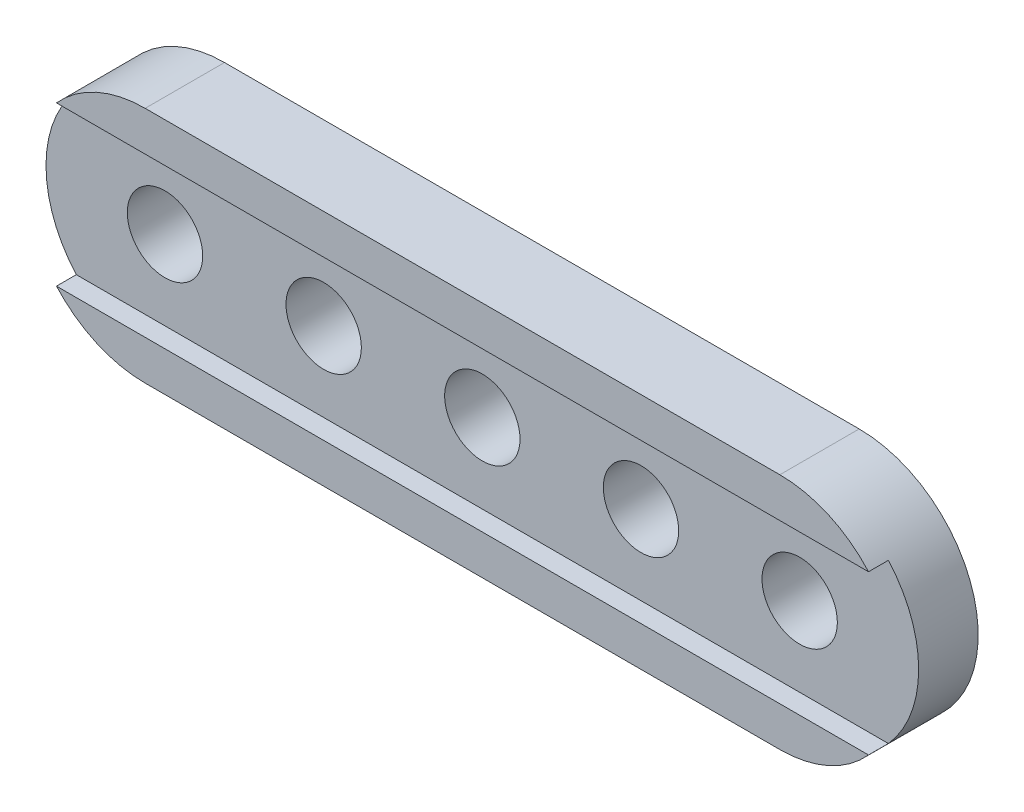
ISO-10303-21;
HEADER;
FILE_DESCRIPTION(('STEP AP214'),'2;1');
FILE_NAME('part.step','',(''),(''),'','','');
FILE_SCHEMA(('AUTOMOTIVE_DESIGN { 1 0 10303 214 1 1 1 1 }'));
ENDSEC;
DATA;
#1=APPLICATION_CONTEXT('core data for automotive mechanical design processes');
#2=APPLICATION_PROTOCOL_DEFINITION('international standard','automotive_design',2000,#1);
#3=PRODUCT_CONTEXT('',#1,'mechanical');
#4=PRODUCT('Part','Part','',(#3));
#5=PRODUCT_RELATED_PRODUCT_CATEGORY('part','',(#4));
#6=PRODUCT_DEFINITION_FORMATION('','',#4);
#7=PRODUCT_DEFINITION_CONTEXT('part definition',#1,'design');
#8=PRODUCT_DEFINITION('design','',#6,#7);
#9=PRODUCT_DEFINITION_SHAPE('','',#8);
#10=(LENGTH_UNIT() NAMED_UNIT(*) SI_UNIT(.MILLI.,.METRE.));
#11=(NAMED_UNIT(*) PLANE_ANGLE_UNIT() SI_UNIT($,.RADIAN.));
#12=(NAMED_UNIT(*) SI_UNIT($,.STERADIAN.) SOLID_ANGLE_UNIT());
#13=UNCERTAINTY_MEASURE_WITH_UNIT(LENGTH_MEASURE(1.E-05),#10,'distance_accuracy_value','');
#14=(GEOMETRIC_REPRESENTATION_CONTEXT(3) GLOBAL_UNCERTAINTY_ASSIGNED_CONTEXT((#13)) GLOBAL_UNIT_ASSIGNED_CONTEXT((#10,
#11,#12)) REPRESENTATION_CONTEXT('',''));
#15=CARTESIAN_POINT('',(0.,0.,0.));
#16=DIRECTION('',(0.,0.,1.));
#17=DIRECTION('',(1.,0.,0.));
#18=AXIS2_PLACEMENT_3D('',#15,#16,#17);
#19=CARTESIAN_POINT('',(8.,0.,0.));
#20=DIRECTION('',(0.,0.,1.));
#21=DIRECTION('',(1.,0.,0.));
#22=AXIS2_PLACEMENT_3D('',#19,#20,#21);
#23=CYLINDRICAL_SURFACE('',#22,1.9);
#24=CARTESIAN_POINT('',(8.,0.,0.));
#25=DIRECTION('',(0.,0.,1.));
#26=DIRECTION('',(1.,0.,0.));
#27=AXIS2_PLACEMENT_3D('',#24,#25,#26);
#28=CIRCLE('',#27,1.9);
#29=CARTESIAN_POINT('',(9.9,0.,0.));
#30=VERTEX_POINT('',#29);
#31=EDGE_CURVE('E47',#30,#30,#28,.T.);
#32=ORIENTED_EDGE('',*,*,#31,.F.);
#33=EDGE_LOOP('',(#32));
#34=FACE_BOUND('',#33,.T.);
#35=CARTESIAN_POINT('',(8.,0.,3.));
#36=DIRECTION('',(0.,0.,1.));
#37=DIRECTION('',(1.,0.,0.));
#38=AXIS2_PLACEMENT_3D('',#35,#36,#37);
#39=CIRCLE('',#38,1.9);
#40=CARTESIAN_POINT('',(9.9,0.,3.));
#41=VERTEX_POINT('',#40);
#42=EDGE_CURVE('E11',#41,#41,#39,.T.);
#43=ORIENTED_EDGE('',*,*,#42,.T.);
#44=EDGE_LOOP('',(#43));
#45=FACE_BOUND('',#44,.T.);
#46=ADVANCED_FACE('F39',(#34,#45),#23,.F.);
#47=CARTESIAN_POINT('',(0.,0.,0.));
#48=DIRECTION('',(0.,0.,1.));
#49=DIRECTION('',(1.,0.,0.));
#50=AXIS2_PLACEMENT_3D('',#47,#48,#49);
#51=CYLINDRICAL_SURFACE('',#50,1.9);
#52=CARTESIAN_POINT('',(0.,0.,0.));
#53=DIRECTION('',(0.,0.,1.));
#54=DIRECTION('',(1.,0.,0.));
#55=AXIS2_PLACEMENT_3D('',#52,#53,#54);
#56=CIRCLE('',#55,1.9);
#57=CARTESIAN_POINT('',(1.9,0.,0.));
#58=VERTEX_POINT('',#57);
#59=EDGE_CURVE('E175',#58,#58,#56,.T.);
#60=ORIENTED_EDGE('',*,*,#59,.F.);
#61=EDGE_LOOP('',(#60));
#62=FACE_BOUND('',#61,.T.);
#63=CARTESIAN_POINT('',(0.,0.,3.));
#64=DIRECTION('',(0.,0.,1.));
#65=DIRECTION('',(1.,0.,0.));
#66=AXIS2_PLACEMENT_3D('',#63,#64,#65);
#67=CIRCLE('',#66,1.9);
#68=CARTESIAN_POINT('',(1.9,0.,3.));
#69=VERTEX_POINT('',#68);
#70=EDGE_CURVE('E179',#69,#69,#67,.T.);
#71=ORIENTED_EDGE('',*,*,#70,.T.);
#72=EDGE_LOOP('',(#71));
#73=FACE_BOUND('',#72,.T.);
#74=ADVANCED_FACE('F190',(#62,#73),#51,.F.);
#75=CARTESIAN_POINT('',(-16.,0.,4.));
#76=DIRECTION('',(0.,0.,1.));
#77=DIRECTION('',(1.,0.,0.));
#78=AXIS2_PLACEMENT_3D('',#75,#76,#77);
#79=PLANE('',#78);
#80=DIRECTION('',(-1.,0.,0.));
#81=VECTOR('',#80,1.);
#82=CARTESIAN_POINT('',(-16.,4.,4.));
#83=LINE('',#82,#81);
#84=CARTESIAN_POINT('',(20.4721359549996,4.,4.));
#85=VERTEX_POINT('',#84);
#86=CARTESIAN_POINT('',(-20.4721359549996,4.,4.));
#87=VERTEX_POINT('',#86);
#88=EDGE_CURVE('E119',#85,#87,#83,.T.);
#89=ORIENTED_EDGE('',*,*,#88,.F.);
#90=CARTESIAN_POINT('',(16.,0.,4.));
#91=DIRECTION('',(0.,0.,1.));
#92=DIRECTION('',(1.,0.,0.));
#93=AXIS2_PLACEMENT_3D('',#90,#91,#92);
#94=CIRCLE('',#93,6.);
#95=CARTESIAN_POINT('',(16.,6.00000000000001,4.));
#96=VERTEX_POINT('',#95);
#97=EDGE_CURVE('E138',#85,#96,#94,.T.);
#98=ORIENTED_EDGE('',*,*,#97,.T.);
#99=DIRECTION('',(-1.,0.,0.));
#100=VECTOR('',#99,1.);
#101=CARTESIAN_POINT('',(-16.,6.,4.));
#102=LINE('',#101,#100);
#103=CARTESIAN_POINT('',(-16.,6.,4.));
#104=VERTEX_POINT('',#103);
#105=EDGE_CURVE('E63',#96,#104,#102,.T.);
#106=ORIENTED_EDGE('',*,*,#105,.T.);
#107=CARTESIAN_POINT('',(-16.,0.,4.));
#108=DIRECTION('',(0.,0.,1.));
#109=DIRECTION('',(1.,0.,0.));
#110=AXIS2_PLACEMENT_3D('',#107,#108,#109);
#111=CIRCLE('',#110,6.);
#112=EDGE_CURVE('E244',#104,#87,#111,.T.);
#113=ORIENTED_EDGE('',*,*,#112,.T.);
#114=EDGE_LOOP('',(#89,#98,#106,#113));
#115=FACE_BOUND('',#114,.T.);
#116=ADVANCED_FACE('F216',(#115),#79,.T.);
#117=CARTESIAN_POINT('',(-16.,0.,4.));
#118=DIRECTION('',(0.,0.,-1.));
#119=DIRECTION('',(-1.,0.,0.));
#120=AXIS2_PLACEMENT_3D('',#117,#118,#119);
#121=CYLINDRICAL_SURFACE('',#120,6.);
#122=CARTESIAN_POINT('',(-16.,0.,3.));
#123=DIRECTION('',(0.,0.,1.));
#124=DIRECTION('',(1.,0.,0.));
#125=AXIS2_PLACEMENT_3D('',#122,#123,#124);
#126=CIRCLE('',#125,6.);
#127=CARTESIAN_POINT('',(-20.4721359549996,4.,3.));
#128=VERTEX_POINT('',#127);
#129=CARTESIAN_POINT('',(-20.4721359549996,-4.,3.));
#130=VERTEX_POINT('',#129);
#131=EDGE_CURVE('E152',#128,#130,#126,.T.);
#132=ORIENTED_EDGE('',*,*,#131,.F.);
#133=DIRECTION('',(0.,0.,-1.));
#134=VECTOR('',#133,1.);
#135=CARTESIAN_POINT('',(-20.4721359549996,4.,4.));
#136=LINE('',#135,#134);
#137=EDGE_CURVE('E250',#128,#87,#136,.F.);
#138=ORIENTED_EDGE('',*,*,#137,.T.);
#139=ORIENTED_EDGE('',*,*,#112,.F.);
#140=DIRECTION('',(0.,0.,-1.));
#141=VECTOR('',#140,1.);
#142=CARTESIAN_POINT('',(-16.,6.,4.));
#143=LINE('',#142,#141);
#144=CARTESIAN_POINT('',(-16.,6.,0.));
#145=VERTEX_POINT('',#144);
#146=EDGE_CURVE('E142',#104,#145,#143,.T.);
#147=ORIENTED_EDGE('',*,*,#146,.T.);
#148=CARTESIAN_POINT('',(-16.,0.,0.));
#149=DIRECTION('',(0.,0.,1.));
#150=DIRECTION('',(1.,0.,0.));
#151=AXIS2_PLACEMENT_3D('',#148,#149,#150);
#152=CIRCLE('',#151,6.);
#153=CARTESIAN_POINT('',(-16.,-6.,0.));
#154=VERTEX_POINT('',#153);
#155=EDGE_CURVE('E147',#145,#154,#152,.T.);
#156=ORIENTED_EDGE('',*,*,#155,.T.);
#157=DIRECTION('',(0.,0.,-1.));
#158=VECTOR('',#157,1.);
#159=CARTESIAN_POINT('',(-16.,-6.,4.));
#160=LINE('',#159,#158);
#161=CARTESIAN_POINT('',(-16.,-6.,4.));
#162=VERTEX_POINT('',#161);
#163=EDGE_CURVE('E120',#162,#154,#160,.T.);
#164=ORIENTED_EDGE('',*,*,#163,.F.);
#165=CARTESIAN_POINT('',(-20.4721359549996,-4.,4.));
#166=VERTEX_POINT('',#165);
#167=EDGE_CURVE('E91',#166,#162,#111,.T.);
#168=ORIENTED_EDGE('',*,*,#167,.F.);
#169=DIRECTION('',(0.,0.,-1.));
#170=VECTOR('',#169,1.);
#171=CARTESIAN_POINT('',(-20.4721359549996,-4.,4.));
#172=LINE('',#171,#170);
#173=EDGE_CURVE('E54',#166,#130,#172,.T.);
#174=ORIENTED_EDGE('',*,*,#173,.T.);
#175=EDGE_LOOP('',(#132,#138,#139,#147,#156,#164,#168,#174));
#176=FACE_BOUND('',#175,.T.);
#177=ADVANCED_FACE('F225',(#176),#121,.T.);
#178=CARTESIAN_POINT('',(-16.,-6.,4.));
#179=DIRECTION('',(0.,1.,0.));
#180=DIRECTION('',(-1.,0.,0.));
#181=AXIS2_PLACEMENT_3D('',#178,#179,#180);
#182=PLANE('',#181);
#183=DIRECTION('',(1.,0.,0.));
#184=VECTOR('',#183,1.);
#185=CARTESIAN_POINT('',(-16.,-6.,0.));
#186=LINE('',#185,#184);
#187=CARTESIAN_POINT('',(16.,-5.99999999999999,0.));
#188=VERTEX_POINT('',#187);
#189=EDGE_CURVE('E151',#154,#188,#186,.T.);
#190=ORIENTED_EDGE('',*,*,#189,.T.);
#191=DIRECTION('',(0.,0.,-1.));
#192=VECTOR('',#191,1.);
#193=CARTESIAN_POINT('',(16.,-5.99999999999999,4.));
#194=LINE('',#193,#192);
#195=CARTESIAN_POINT('',(16.,-5.99999999999999,4.));
#196=VERTEX_POINT('',#195);
#197=EDGE_CURVE('E165',#196,#188,#194,.T.);
#198=ORIENTED_EDGE('',*,*,#197,.F.);
#199=DIRECTION('',(1.,0.,0.));
#200=VECTOR('',#199,1.);
#201=CARTESIAN_POINT('',(-16.,-6.,4.));
#202=LINE('',#201,#200);
#203=EDGE_CURVE('E135',#162,#196,#202,.T.);
#204=ORIENTED_EDGE('',*,*,#203,.F.);
#205=ORIENTED_EDGE('',*,*,#163,.T.);
#206=EDGE_LOOP('',(#190,#198,#204,#205));
#207=FACE_BOUND('',#206,.T.);
#208=ADVANCED_FACE('F222',(#207),#182,.F.);
#209=CARTESIAN_POINT('',(16.,0.,4.));
#210=DIRECTION('',(0.,0.,-1.));
#211=DIRECTION('',(-1.,0.,0.));
#212=AXIS2_PLACEMENT_3D('',#209,#210,#211);
#213=CYLINDRICAL_SURFACE('',#212,6.);
#214=ORIENTED_EDGE('',*,*,#97,.F.);
#215=DIRECTION('',(0.,0.,-1.));
#216=VECTOR('',#215,1.);
#217=CARTESIAN_POINT('',(20.4721359549996,4.,4.));
#218=LINE('',#217,#216);
#219=CARTESIAN_POINT('',(20.4721359549996,4.,3.));
#220=VERTEX_POINT('',#219);
#221=EDGE_CURVE('E246',#85,#220,#218,.T.);
#222=ORIENTED_EDGE('',*,*,#221,.T.);
#223=CARTESIAN_POINT('',(16.,0.,3.));
#224=DIRECTION('',(0.,0.,1.));
#225=DIRECTION('',(1.,0.,0.));
#226=AXIS2_PLACEMENT_3D('',#223,#224,#225);
#227=CIRCLE('',#226,6.);
#228=CARTESIAN_POINT('',(20.4721359549996,-4.,3.));
#229=VERTEX_POINT('',#228);
#230=EDGE_CURVE('E130',#229,#220,#227,.T.);
#231=ORIENTED_EDGE('',*,*,#230,.F.);
#232=DIRECTION('',(0.,0.,-1.));
#233=VECTOR('',#232,1.);
#234=CARTESIAN_POINT('',(20.4721359549996,-4.,4.));
#235=LINE('',#234,#233);
#236=CARTESIAN_POINT('',(20.4721359549996,-4.,4.));
#237=VERTEX_POINT('',#236);
#238=EDGE_CURVE('E115',#229,#237,#235,.F.);
#239=ORIENTED_EDGE('',*,*,#238,.T.);
#240=EDGE_CURVE('E128',#196,#237,#94,.T.);
#241=ORIENTED_EDGE('',*,*,#240,.F.);
#242=ORIENTED_EDGE('',*,*,#197,.T.);
#243=CARTESIAN_POINT('',(16.,0.,0.));
#244=DIRECTION('',(0.,0.,1.));
#245=DIRECTION('',(1.,0.,0.));
#246=AXIS2_PLACEMENT_3D('',#243,#244,#245);
#247=CIRCLE('',#246,6.);
#248=CARTESIAN_POINT('',(16.,6.00000000000001,0.));
#249=VERTEX_POINT('',#248);
#250=EDGE_CURVE('E155',#188,#249,#247,.T.);
#251=ORIENTED_EDGE('',*,*,#250,.T.);
#252=DIRECTION('',(0.,0.,-1.));
#253=VECTOR('',#252,1.);
#254=CARTESIAN_POINT('',(16.,6.00000000000001,4.));
#255=LINE('',#254,#253);
#256=EDGE_CURVE('E162',#96,#249,#255,.T.);
#257=ORIENTED_EDGE('',*,*,#256,.F.);
#258=EDGE_LOOP('',(#214,#222,#231,#239,#241,#242,#251,#257));
#259=FACE_BOUND('',#258,.T.);
#260=ADVANCED_FACE('F126',(#259),#213,.T.);
#261=CARTESIAN_POINT('',(-16.,6.,4.));
#262=DIRECTION('',(0.,-1.,0.));
#263=DIRECTION('',(1.,0.,0.));
#264=AXIS2_PLACEMENT_3D('',#261,#262,#263);
#265=PLANE('',#264);
#266=DIRECTION('',(-1.,0.,0.));
#267=VECTOR('',#266,1.);
#268=CARTESIAN_POINT('',(-16.,6.,0.));
#269=LINE('',#268,#267);
#270=EDGE_CURVE('E84',#249,#145,#269,.T.);
#271=ORIENTED_EDGE('',*,*,#270,.T.);
#272=ORIENTED_EDGE('',*,*,#146,.F.);
#273=ORIENTED_EDGE('',*,*,#105,.F.);
#274=ORIENTED_EDGE('',*,*,#256,.T.);
#275=EDGE_LOOP('',(#271,#272,#273,#274));
#276=FACE_BOUND('',#275,.T.);
#277=ADVANCED_FACE('F215',(#276),#265,.F.);
#278=DIRECTION('',(1.,0.,0.));
#279=VECTOR('',#278,1.);
#280=CARTESIAN_POINT('',(-16.,-4.,4.));
#281=LINE('',#280,#279);
#282=EDGE_CURVE('E112',#166,#237,#281,.T.);
#283=ORIENTED_EDGE('',*,*,#282,.F.);
#284=ORIENTED_EDGE('',*,*,#167,.T.);
#285=ORIENTED_EDGE('',*,*,#203,.T.);
#286=ORIENTED_EDGE('',*,*,#240,.T.);
#287=EDGE_LOOP('',(#283,#284,#285,#286));
#288=FACE_BOUND('',#287,.T.);
#289=ADVANCED_FACE('F134',(#288),#79,.T.);
#290=CARTESIAN_POINT('',(-16.,0.,0.));
#291=DIRECTION('',(0.,0.,1.));
#292=DIRECTION('',(1.,0.,0.));
#293=AXIS2_PLACEMENT_3D('',#290,#291,#292);
#294=PLANE('',#293);
#295=CARTESIAN_POINT('',(16.,0.,0.));
#296=DIRECTION('',(0.,0.,1.));
#297=DIRECTION('',(1.,0.,0.));
#298=AXIS2_PLACEMENT_3D('',#295,#296,#297);
#299=CIRCLE('',#298,1.9);
#300=CARTESIAN_POINT('',(17.9,0.,0.));
#301=VERTEX_POINT('',#300);
#302=EDGE_CURVE('E285',#301,#301,#299,.T.);
#303=ORIENTED_EDGE('',*,*,#302,.T.);
#304=EDGE_LOOP('',(#303));
#305=FACE_BOUND('',#304,.T.);
#306=CARTESIAN_POINT('',(-8.,0.,0.));
#307=DIRECTION('',(0.,0.,1.));
#308=DIRECTION('',(1.,0.,0.));
#309=AXIS2_PLACEMENT_3D('',#306,#307,#308);
#310=CIRCLE('',#309,1.9);
#311=CARTESIAN_POINT('',(-6.1,0.,0.));
#312=VERTEX_POINT('',#311);
#313=EDGE_CURVE('E281',#312,#312,#310,.T.);
#314=ORIENTED_EDGE('',*,*,#313,.T.);
#315=EDGE_LOOP('',(#314));
#316=FACE_BOUND('',#315,.T.);
#317=CARTESIAN_POINT('',(-16.,0.,0.));
#318=DIRECTION('',(0.,0.,1.));
#319=DIRECTION('',(1.,0.,0.));
#320=AXIS2_PLACEMENT_3D('',#317,#318,#319);
#321=CIRCLE('',#320,1.9);
#322=CARTESIAN_POINT('',(-14.1,0.,0.));
#323=VERTEX_POINT('',#322);
#324=EDGE_CURVE('E269',#323,#323,#321,.T.);
#325=ORIENTED_EDGE('',*,*,#324,.T.);
#326=EDGE_LOOP('',(#325));
#327=FACE_BOUND('',#326,.T.);
#328=ORIENTED_EDGE('',*,*,#155,.F.);
#329=ORIENTED_EDGE('',*,*,#270,.F.);
#330=ORIENTED_EDGE('',*,*,#250,.F.);
#331=ORIENTED_EDGE('',*,*,#189,.F.);
#332=EDGE_LOOP('',(#328,#329,#330,#331));
#333=FACE_BOUND('',#332,.T.);
#334=ORIENTED_EDGE('',*,*,#59,.T.);
#335=EDGE_LOOP('',(#334));
#336=FACE_BOUND('',#335,.T.);
#337=ORIENTED_EDGE('',*,*,#31,.T.);
#338=EDGE_LOOP('',(#337));
#339=FACE_BOUND('',#338,.T.);
#340=ADVANCED_FACE('F186',(#305,#316,#327,#333,#336,#339),#294,.F.);
#341=CARTESIAN_POINT('',(0.,0.,3.));
#342=DIRECTION('',(0.,0.,1.));
#343=DIRECTION('',(1.,0.,0.));
#344=AXIS2_PLACEMENT_3D('',#341,#342,#343);
#345=PLANE('',#344);
#346=CARTESIAN_POINT('',(16.,0.,3.));
#347=DIRECTION('',(0.,0.,1.));
#348=DIRECTION('',(1.,0.,0.));
#349=AXIS2_PLACEMENT_3D('',#346,#347,#348);
#350=CIRCLE('',#349,1.9);
#351=CARTESIAN_POINT('',(17.9,0.,3.));
#352=VERTEX_POINT('',#351);
#353=EDGE_CURVE('E286',#352,#352,#350,.T.);
#354=ORIENTED_EDGE('',*,*,#353,.F.);
#355=EDGE_LOOP('',(#354));
#356=FACE_BOUND('',#355,.T.);
#357=CARTESIAN_POINT('',(-8.,0.,3.));
#358=DIRECTION('',(0.,0.,1.));
#359=DIRECTION('',(1.,0.,0.));
#360=AXIS2_PLACEMENT_3D('',#357,#358,#359);
#361=CIRCLE('',#360,1.9);
#362=CARTESIAN_POINT('',(-6.1,0.,3.));
#363=VERTEX_POINT('',#362);
#364=EDGE_CURVE('E274',#363,#363,#361,.T.);
#365=ORIENTED_EDGE('',*,*,#364,.F.);
#366=EDGE_LOOP('',(#365));
#367=FACE_BOUND('',#366,.T.);
#368=CARTESIAN_POINT('',(-16.,0.,3.));
#369=DIRECTION('',(0.,0.,1.));
#370=DIRECTION('',(1.,0.,0.));
#371=AXIS2_PLACEMENT_3D('',#368,#369,#370);
#372=CIRCLE('',#371,1.9);
#373=CARTESIAN_POINT('',(-14.1,0.,3.));
#374=VERTEX_POINT('',#373);
#375=EDGE_CURVE('E270',#374,#374,#372,.T.);
#376=ORIENTED_EDGE('',*,*,#375,.F.);
#377=EDGE_LOOP('',(#376));
#378=FACE_BOUND('',#377,.T.);
#379=ORIENTED_EDGE('',*,*,#131,.T.);
#380=DIRECTION('',(1.,0.,0.));
#381=VECTOR('',#380,1.);
#382=CARTESIAN_POINT('',(-22.,-4.,3.));
#383=LINE('',#382,#381);
#384=EDGE_CURVE('E266',#130,#229,#383,.T.);
#385=ORIENTED_EDGE('',*,*,#384,.T.);
#386=ORIENTED_EDGE('',*,*,#230,.T.);
#387=DIRECTION('',(-1.,0.,0.));
#388=VECTOR('',#387,1.);
#389=CARTESIAN_POINT('',(-22.,4.,3.));
#390=LINE('',#389,#388);
#391=EDGE_CURVE('E132',#220,#128,#390,.T.);
#392=ORIENTED_EDGE('',*,*,#391,.T.);
#393=EDGE_LOOP('',(#379,#385,#386,#392));
#394=FACE_BOUND('',#393,.T.);
#395=ORIENTED_EDGE('',*,*,#70,.F.);
#396=EDGE_LOOP('',(#395));
#397=FACE_BOUND('',#396,.T.);
#398=ORIENTED_EDGE('',*,*,#42,.F.);
#399=EDGE_LOOP('',(#398));
#400=FACE_BOUND('',#399,.T.);
#401=ADVANCED_FACE('F193',(#356,#367,#378,#394,#397,#400),#345,.T.);
#402=CARTESIAN_POINT('',(-22.,4.,3.));
#403=DIRECTION('',(0.,1.,0.));
#404=DIRECTION('',(0.,0.,1.));
#405=AXIS2_PLACEMENT_3D('',#402,#403,#404);
#406=PLANE('',#405);
#407=ORIENTED_EDGE('',*,*,#391,.F.);
#408=ORIENTED_EDGE('',*,*,#221,.F.);
#409=ORIENTED_EDGE('',*,*,#88,.T.);
#410=ORIENTED_EDGE('',*,*,#137,.F.);
#411=EDGE_LOOP('',(#407,#408,#409,#410));
#412=FACE_BOUND('',#411,.T.);
#413=ADVANCED_FACE('F195',(#412),#406,.F.);
#414=CARTESIAN_POINT('',(-22.,-4.,3.));
#415=DIRECTION('',(0.,-1.,0.));
#416=DIRECTION('',(0.,0.,-1.));
#417=AXIS2_PLACEMENT_3D('',#414,#415,#416);
#418=PLANE('',#417);
#419=ORIENTED_EDGE('',*,*,#282,.T.);
#420=ORIENTED_EDGE('',*,*,#238,.F.);
#421=ORIENTED_EDGE('',*,*,#384,.F.);
#422=ORIENTED_EDGE('',*,*,#173,.F.);
#423=EDGE_LOOP('',(#419,#420,#421,#422));
#424=FACE_BOUND('',#423,.T.);
#425=ADVANCED_FACE('F114',(#424),#418,.F.);
#426=CARTESIAN_POINT('',(-16.,0.,0.));
#427=DIRECTION('',(0.,0.,1.));
#428=DIRECTION('',(1.,0.,0.));
#429=AXIS2_PLACEMENT_3D('',#426,#427,#428);
#430=CYLINDRICAL_SURFACE('',#429,1.9);
#431=ORIENTED_EDGE('',*,*,#324,.F.);
#432=EDGE_LOOP('',(#431));
#433=FACE_BOUND('',#432,.T.);
#434=ORIENTED_EDGE('',*,*,#375,.T.);
#435=EDGE_LOOP('',(#434));
#436=FACE_BOUND('',#435,.T.);
#437=ADVANCED_FACE('F209',(#433,#436),#430,.F.);
#438=CARTESIAN_POINT('',(-8.,0.,0.));
#439=DIRECTION('',(0.,0.,1.));
#440=DIRECTION('',(1.,0.,0.));
#441=AXIS2_PLACEMENT_3D('',#438,#439,#440);
#442=CYLINDRICAL_SURFACE('',#441,1.9);
#443=ORIENTED_EDGE('',*,*,#313,.F.);
#444=EDGE_LOOP('',(#443));
#445=FACE_BOUND('',#444,.T.);
#446=ORIENTED_EDGE('',*,*,#364,.T.);
#447=EDGE_LOOP('',(#446));
#448=FACE_BOUND('',#447,.T.);
#449=ADVANCED_FACE('F298',(#445,#448),#442,.F.);
#450=CARTESIAN_POINT('',(16.,0.,0.));
#451=DIRECTION('',(0.,0.,1.));
#452=DIRECTION('',(1.,0.,0.));
#453=AXIS2_PLACEMENT_3D('',#450,#451,#452);
#454=CYLINDRICAL_SURFACE('',#453,1.9);
#455=ORIENTED_EDGE('',*,*,#302,.F.);
#456=EDGE_LOOP('',(#455));
#457=FACE_BOUND('',#456,.T.);
#458=ORIENTED_EDGE('',*,*,#353,.T.);
#459=EDGE_LOOP('',(#458));
#460=FACE_BOUND('',#459,.T.);
#461=ADVANCED_FACE('F295',(#457,#460),#454,.F.);
#462=CLOSED_SHELL('',(#46,#74,#116,#177,#208,#260,#277,#289,#340,#401,#413,#425,#437,#449,#461));
#463=MANIFOLD_SOLID_BREP('B2',#462);
#464=ADVANCED_BREP_SHAPE_REPRESENTATION('',(#18,#463),#14);
#465=SHAPE_DEFINITION_REPRESENTATION(#9,#464);
ENDSEC;
END-ISO-10303-21;
